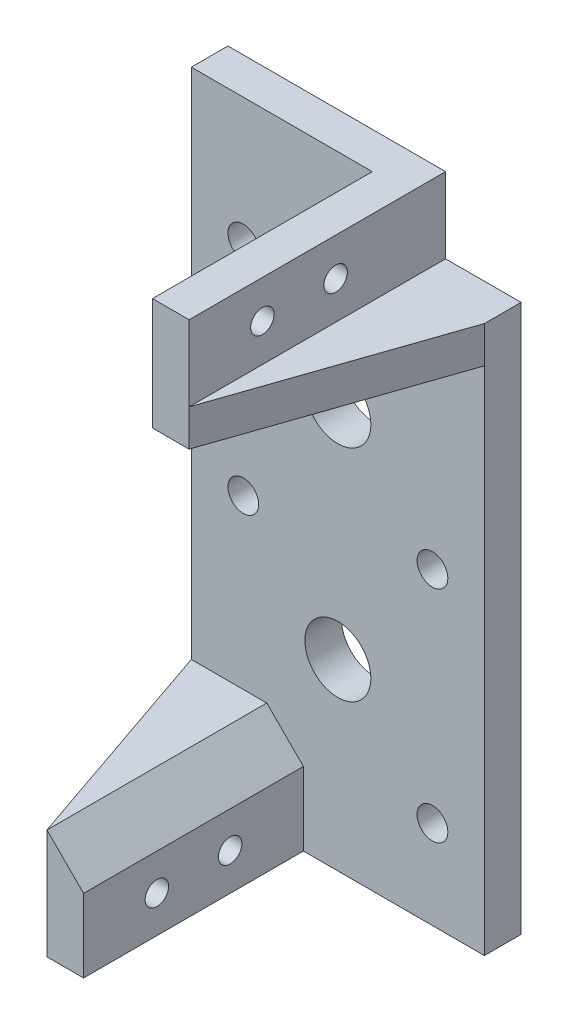
ISO-10303-21;
HEADER;
FILE_DESCRIPTION(('STEP AP214'),'2;1');
FILE_NAME('part.step','',(''),(''),'','','');
FILE_SCHEMA(('AUTOMOTIVE_DESIGN { 1 0 10303 214 1 1 1 1 }'));
ENDSEC;
DATA;
#1=APPLICATION_CONTEXT('core data for automotive mechanical design processes');
#2=APPLICATION_PROTOCOL_DEFINITION('international standard','automotive_design',2000,#1);
#3=PRODUCT_CONTEXT('',#1,'mechanical');
#4=PRODUCT('Part','Part','',(#3));
#5=PRODUCT_RELATED_PRODUCT_CATEGORY('part','',(#4));
#6=PRODUCT_DEFINITION_FORMATION('','',#4);
#7=PRODUCT_DEFINITION_CONTEXT('part definition',#1,'design');
#8=PRODUCT_DEFINITION('design','',#6,#7);
#9=PRODUCT_DEFINITION_SHAPE('','',#8);
#10=(LENGTH_UNIT() NAMED_UNIT(*) SI_UNIT(.MILLI.,.METRE.));
#11=(NAMED_UNIT(*) PLANE_ANGLE_UNIT() SI_UNIT($,.RADIAN.));
#12=(NAMED_UNIT(*) SI_UNIT($,.STERADIAN.) SOLID_ANGLE_UNIT());
#13=UNCERTAINTY_MEASURE_WITH_UNIT(LENGTH_MEASURE(1.E-05),#10,'distance_accuracy_value','');
#14=(GEOMETRIC_REPRESENTATION_CONTEXT(3) GLOBAL_UNCERTAINTY_ASSIGNED_CONTEXT((#13)) GLOBAL_UNIT_ASSIGNED_CONTEXT((#10,
#11,#12)) REPRESENTATION_CONTEXT('',''));
#15=CARTESIAN_POINT('',(0.,0.,0.));
#16=DIRECTION('',(0.,0.,1.));
#17=DIRECTION('',(1.,0.,0.));
#18=AXIS2_PLACEMENT_3D('',#15,#16,#17);
#19=CARTESIAN_POINT('',(0.,0.,0.));
#20=DIRECTION('',(0.,0.,-1.));
#21=DIRECTION('',(1.,0.,0.));
#22=AXIS2_PLACEMENT_3D('',#19,#20,#21);
#23=PLANE('',#22);
#24=CARTESIAN_POINT('',(32.9046987566547,-30.4046987566544,0.));
#25=DIRECTION('',(0.,0.,-1.));
#26=DIRECTION('',(-1.,0.,0.));
#27=AXIS2_PLACEMENT_3D('',#24,#25,#26);
#28=CIRCLE('',#27,2.1);
#29=CARTESIAN_POINT('',(30.8046987566547,-30.4046987566544,0.));
#30=VERTEX_POINT('',#29);
#31=EDGE_CURVE('E275',#30,#30,#28,.T.);
#32=ORIENTED_EDGE('',*,*,#31,.T.);
#33=EDGE_LOOP('',(#32));
#34=FACE_BOUND('',#33,.T.);
#35=CARTESIAN_POINT('',(7.09530124334588,25.4046987566544,0.));
#36=DIRECTION('',(0.,0.,-1.));
#37=DIRECTION('',(-1.,0.,0.));
#38=AXIS2_PLACEMENT_3D('',#35,#36,#37);
#39=CIRCLE('',#38,2.1);
#40=CARTESIAN_POINT('',(4.99530124334588,25.4046987566544,0.));
#41=VERTEX_POINT('',#40);
#42=EDGE_CURVE('E276',#41,#41,#39,.T.);
#43=ORIENTED_EDGE('',*,*,#42,.T.);
#44=EDGE_LOOP('',(#43));
#45=FACE_BOUND('',#44,.T.);
#46=CARTESIAN_POINT('',(32.904698756655,-0.404698756654425,0.));
#47=DIRECTION('',(0.,0.,-1.));
#48=DIRECTION('',(-1.,0.,0.));
#49=AXIS2_PLACEMENT_3D('',#46,#47,#48);
#50=CIRCLE('',#49,2.1);
#51=CARTESIAN_POINT('',(30.804698756655,-0.404698756654425,0.));
#52=VERTEX_POINT('',#51);
#53=EDGE_CURVE('E283',#52,#52,#50,.T.);
#54=ORIENTED_EDGE('',*,*,#53,.T.);
#55=EDGE_LOOP('',(#54));
#56=FACE_BOUND('',#55,.T.);
#57=CARTESIAN_POINT('',(20.0000000000001,-17.5,0.));
#58=DIRECTION('',(0.,0.,-1.));
#59=DIRECTION('',(-1.,0.,0.));
#60=AXIS2_PLACEMENT_3D('',#57,#58,#59);
#61=CIRCLE('',#60,4.5);
#62=CARTESIAN_POINT('',(15.5000000000001,-17.5,0.));
#63=VERTEX_POINT('',#62);
#64=EDGE_CURVE('E262',#63,#63,#61,.T.);
#65=ORIENTED_EDGE('',*,*,#64,.T.);
#66=EDGE_LOOP('',(#65));
#67=FACE_BOUND('',#66,.T.);
#68=CARTESIAN_POINT('',(7.09530124334557,-4.59530124334556,0.));
#69=DIRECTION('',(0.,0.,-1.));
#70=DIRECTION('',(-1.,0.,0.));
#71=AXIS2_PLACEMENT_3D('',#68,#69,#70);
#72=CIRCLE('',#71,2.1);
#73=CARTESIAN_POINT('',(4.99530124334556,-4.59530124334556,0.));
#74=VERTEX_POINT('',#73);
#75=EDGE_CURVE('E269',#74,#74,#72,.T.);
#76=ORIENTED_EDGE('',*,*,#75,.T.);
#77=EDGE_LOOP('',(#76));
#78=FACE_BOUND('',#77,.T.);
#79=CARTESIAN_POINT('',(20.0000000000004,12.5,0.));
#80=DIRECTION('',(0.,0.,-1.));
#81=DIRECTION('',(-1.,0.,0.));
#82=AXIS2_PLACEMENT_3D('',#79,#80,#81);
#83=CIRCLE('',#82,4.5);
#84=CARTESIAN_POINT('',(15.5000000000004,12.5,0.));
#85=VERTEX_POINT('',#84);
#86=EDGE_CURVE('E292',#85,#85,#83,.T.);
#87=ORIENTED_EDGE('',*,*,#86,.T.);
#88=EDGE_LOOP('',(#87));
#89=FACE_BOUND('',#88,.T.);
#90=DIRECTION('',(1.,0.,0.));
#91=VECTOR('',#90,1.);
#92=CARTESIAN_POINT('',(10.3,-27.5,0.));
#93=LINE('',#92,#91);
#94=CARTESIAN_POINT('',(0.,-27.5,0.));
#95=VERTEX_POINT('',#94);
#96=CARTESIAN_POINT('',(10.3,-27.5,0.));
#97=VERTEX_POINT('',#96);
#98=EDGE_CURVE('E185',#95,#97,#93,.T.);
#99=ORIENTED_EDGE('',*,*,#98,.T.);
#100=DIRECTION('',(0.707106781186547,-0.707106781186548,0.));
#101=VECTOR('',#100,1.);
#102=CARTESIAN_POINT('',(-8.59999999999998,-8.59999999999998,0.));
#103=LINE('',#102,#101);
#104=CARTESIAN_POINT('',(15.3,-32.5,0.));
#105=VERTEX_POINT('',#104);
#106=EDGE_CURVE('E11',#105,#97,#103,.F.);
#107=ORIENTED_EDGE('',*,*,#106,.F.);
#108=DIRECTION('',(0.,-1.,0.));
#109=VECTOR('',#108,1.);
#110=CARTESIAN_POINT('',(15.3,-42.5,0.));
#111=LINE('',#110,#109);
#112=CARTESIAN_POINT('',(15.3,-42.5,0.));
#113=VERTEX_POINT('',#112);
#114=EDGE_CURVE('E180',#105,#113,#111,.T.);
#115=ORIENTED_EDGE('',*,*,#114,.T.);
#116=DIRECTION('',(1.,0.,0.));
#117=VECTOR('',#116,1.);
#118=CARTESIAN_POINT('',(-40.,-42.5,0.));
#119=LINE('',#118,#117);
#120=CARTESIAN_POINT('',(40.,-42.5,0.));
#121=VERTEX_POINT('',#120);
#122=EDGE_CURVE('E302',#113,#121,#119,.T.);
#123=ORIENTED_EDGE('',*,*,#122,.T.);
#124=DIRECTION('',(0.,1.,0.));
#125=VECTOR('',#124,1.);
#126=CARTESIAN_POINT('',(40.,42.5,0.));
#127=LINE('',#126,#125);
#128=CARTESIAN_POINT('',(40.,27.2,0.));
#129=VERTEX_POINT('',#128);
#130=EDGE_CURVE('E295',#121,#129,#127,.T.);
#131=ORIENTED_EDGE('',*,*,#130,.T.);
#132=DIRECTION('',(-1.,0.,0.));
#133=VECTOR('',#132,1.);
#134=CARTESIAN_POINT('',(0.,27.2,0.));
#135=LINE('',#134,#133);
#136=CARTESIAN_POINT('',(24.7,27.2,0.));
#137=VERTEX_POINT('',#136);
#138=EDGE_CURVE('E224',#129,#137,#135,.T.);
#139=ORIENTED_EDGE('',*,*,#138,.T.);
#140=DIRECTION('',(0.,1.,0.));
#141=VECTOR('',#140,1.);
#142=CARTESIAN_POINT('',(24.7,42.5,0.));
#143=LINE('',#142,#141);
#144=CARTESIAN_POINT('',(24.7,42.5,0.));
#145=VERTEX_POINT('',#144);
#146=EDGE_CURVE('E227',#137,#145,#143,.T.);
#147=ORIENTED_EDGE('',*,*,#146,.T.);
#148=DIRECTION('',(-1.,0.,0.));
#149=VECTOR('',#148,1.);
#150=CARTESIAN_POINT('',(-40.,42.5,0.));
#151=LINE('',#150,#149);
#152=CARTESIAN_POINT('',(0.,42.5,0.));
#153=VERTEX_POINT('',#152);
#154=EDGE_CURVE('E310',#145,#153,#151,.T.);
#155=ORIENTED_EDGE('',*,*,#154,.T.);
#156=DIRECTION('',(0.,-1.,0.));
#157=VECTOR('',#156,1.);
#158=CARTESIAN_POINT('',(0.,-42.5,0.));
#159=LINE('',#158,#157);
#160=EDGE_CURVE('E240',#153,#95,#159,.T.);
#161=ORIENTED_EDGE('',*,*,#160,.T.);
#162=EDGE_LOOP('',(#99,#107,#115,#123,#131,#139,#147,#155,#161));
#163=FACE_BOUND('',#162,.T.);
#164=ADVANCED_FACE('F35',(#34,#45,#56,#67,#78,#89,#163),#23,.F.);
#165=CARTESIAN_POINT('',(40.,42.5,-5.));
#166=DIRECTION('',(-1.,0.,0.));
#167=DIRECTION('',(0.,-1.,0.));
#168=AXIS2_PLACEMENT_3D('',#165,#166,#167);
#169=PLANE('',#168);
#170=DIRECTION('',(0.,0.,1.));
#171=VECTOR('',#170,1.);
#172=CARTESIAN_POINT('',(40.,32.2,-5.001));
#173=LINE('',#172,#171);
#174=CARTESIAN_POINT('',(40.,32.2,-5.));
#175=VERTEX_POINT('',#174);
#176=CARTESIAN_POINT('',(40.,32.2,0.));
#177=VERTEX_POINT('',#176);
#178=EDGE_CURVE('E249',#175,#177,#173,.T.);
#179=ORIENTED_EDGE('',*,*,#178,.T.);
#180=DIRECTION('',(0.,1.,0.));
#181=VECTOR('',#180,1.);
#182=CARTESIAN_POINT('',(40.,27.2,0.));
#183=LINE('',#182,#181);
#184=EDGE_CURVE('E218',#129,#177,#183,.T.);
#185=ORIENTED_EDGE('',*,*,#184,.F.);
#186=ORIENTED_EDGE('',*,*,#130,.F.);
#187=DIRECTION('',(0.,0.,1.));
#188=VECTOR('',#187,1.);
#189=CARTESIAN_POINT('',(40.,-42.5,-5.));
#190=LINE('',#189,#188);
#191=CARTESIAN_POINT('',(40.,-42.5,-5.));
#192=VERTEX_POINT('',#191);
#193=EDGE_CURVE('E307',#192,#121,#190,.T.);
#194=ORIENTED_EDGE('',*,*,#193,.F.);
#195=DIRECTION('',(0.,1.,0.));
#196=VECTOR('',#195,1.);
#197=CARTESIAN_POINT('',(40.,42.5,-5.));
#198=LINE('',#197,#196);
#199=EDGE_CURVE('E298',#192,#175,#198,.T.);
#200=ORIENTED_EDGE('',*,*,#199,.T.);
#201=EDGE_LOOP('',(#179,#185,#186,#194,#200));
#202=FACE_BOUND('',#201,.T.);
#203=ADVANCED_FACE('F361',(#202),#169,.F.);
#204=CARTESIAN_POINT('',(-40.,42.5,-5.));
#205=DIRECTION('',(0.,-1.,0.));
#206=DIRECTION('',(0.,0.,1.));
#207=AXIS2_PLACEMENT_3D('',#204,#205,#206);
#208=PLANE('',#207);
#209=DIRECTION('',(0.,0.,1.));
#210=VECTOR('',#209,1.);
#211=CARTESIAN_POINT('',(29.7,42.5,-5.001));
#212=LINE('',#211,#210);
#213=CARTESIAN_POINT('',(29.7,42.5,-5.));
#214=VERTEX_POINT('',#213);
#215=CARTESIAN_POINT('',(29.7,42.5,30.));
#216=VERTEX_POINT('',#215);
#217=EDGE_CURVE('E250',#214,#216,#212,.T.);
#218=ORIENTED_EDGE('',*,*,#217,.F.);
#219=DIRECTION('',(-1.,0.,0.));
#220=VECTOR('',#219,1.);
#221=CARTESIAN_POINT('',(-40.,42.5,-5.));
#222=LINE('',#221,#220);
#223=CARTESIAN_POINT('',(0.,42.5,-5.));
#224=VERTEX_POINT('',#223);
#225=EDGE_CURVE('E301',#214,#224,#222,.T.);
#226=ORIENTED_EDGE('',*,*,#225,.T.);
#227=DIRECTION('',(0.,0.,1.));
#228=VECTOR('',#227,1.);
#229=CARTESIAN_POINT('',(0.,42.5,-10.));
#230=LINE('',#229,#228);
#231=EDGE_CURVE('E243',#224,#153,#230,.T.);
#232=ORIENTED_EDGE('',*,*,#231,.T.);
#233=ORIENTED_EDGE('',*,*,#154,.F.);
#234=DIRECTION('',(0.,0.,-1.));
#235=VECTOR('',#234,1.);
#236=CARTESIAN_POINT('',(24.7,42.5,30.));
#237=LINE('',#236,#235);
#238=CARTESIAN_POINT('',(24.7,42.5,30.));
#239=VERTEX_POINT('',#238);
#240=EDGE_CURVE('E236',#239,#145,#237,.T.);
#241=ORIENTED_EDGE('',*,*,#240,.F.);
#242=DIRECTION('',(1.,0.,0.));
#243=VECTOR('',#242,1.);
#244=CARTESIAN_POINT('',(29.7,42.5,30.));
#245=LINE('',#244,#243);
#246=EDGE_CURVE('E233',#239,#216,#245,.T.);
#247=ORIENTED_EDGE('',*,*,#246,.T.);
#248=EDGE_LOOP('',(#218,#226,#232,#233,#241,#247));
#249=FACE_BOUND('',#248,.T.);
#250=ADVANCED_FACE('F341',(#249),#208,.F.);
#251=CARTESIAN_POINT('',(-40.,-42.5,-5.));
#252=DIRECTION('',(0.,1.,0.));
#253=DIRECTION('',(0.,0.,-1.));
#254=AXIS2_PLACEMENT_3D('',#251,#252,#253);
#255=PLANE('',#254);
#256=DIRECTION('',(1.,0.,0.));
#257=VECTOR('',#256,1.);
#258=CARTESIAN_POINT('',(-40.,-42.5,-5.));
#259=LINE('',#258,#257);
#260=CARTESIAN_POINT('',(10.3,-42.5,-5.));
#261=VERTEX_POINT('',#260);
#262=EDGE_CURVE('E305',#261,#192,#259,.T.);
#263=ORIENTED_EDGE('',*,*,#262,.T.);
#264=ORIENTED_EDGE('',*,*,#193,.T.);
#265=ORIENTED_EDGE('',*,*,#122,.F.);
#266=DIRECTION('',(0.,0.,-1.));
#267=VECTOR('',#266,1.);
#268=CARTESIAN_POINT('',(15.3,-42.5,30.));
#269=LINE('',#268,#267);
#270=CARTESIAN_POINT('',(15.3,-42.5,30.));
#271=VERTEX_POINT('',#270);
#272=EDGE_CURVE('E190',#271,#113,#269,.T.);
#273=ORIENTED_EDGE('',*,*,#272,.F.);
#274=DIRECTION('',(-1.,0.,0.));
#275=VECTOR('',#274,1.);
#276=CARTESIAN_POINT('',(10.3,-42.5,30.));
#277=LINE('',#276,#275);
#278=CARTESIAN_POINT('',(10.3,-42.5,30.));
#279=VERTEX_POINT('',#278);
#280=EDGE_CURVE('E182',#271,#279,#277,.T.);
#281=ORIENTED_EDGE('',*,*,#280,.T.);
#282=DIRECTION('',(0.,0.,1.));
#283=VECTOR('',#282,1.);
#284=CARTESIAN_POINT('',(10.3,-42.5,-5.001));
#285=LINE('',#284,#283);
#286=EDGE_CURVE('E177',#261,#279,#285,.T.);
#287=ORIENTED_EDGE('',*,*,#286,.F.);
#288=EDGE_LOOP('',(#263,#264,#265,#273,#281,#287));
#289=FACE_BOUND('',#288,.T.);
#290=ADVANCED_FACE('F353',(#289),#255,.F.);
#291=CARTESIAN_POINT('',(0.,0.,-5.));
#292=DIRECTION('',(0.,0.,-1.));
#293=DIRECTION('',(1.,0.,0.));
#294=AXIS2_PLACEMENT_3D('',#291,#292,#293);
#295=PLANE('',#294);
#296=DIRECTION('',(0.,-1.,0.));
#297=VECTOR('',#296,1.);
#298=CARTESIAN_POINT('',(10.3,-42.5,-5.));
#299=LINE('',#298,#297);
#300=CARTESIAN_POINT('',(10.3,-32.2,-5.));
#301=VERTEX_POINT('',#300);
#302=EDGE_CURVE('E195',#301,#261,#299,.T.);
#303=ORIENTED_EDGE('',*,*,#302,.F.);
#304=DIRECTION('',(1.,0.,0.));
#305=VECTOR('',#304,1.);
#306=CARTESIAN_POINT('',(0.,-32.2,-5.));
#307=LINE('',#306,#305);
#308=CARTESIAN_POINT('',(0.,-32.2,-5.));
#309=VERTEX_POINT('',#308);
#310=EDGE_CURVE('E201',#309,#301,#307,.T.);
#311=ORIENTED_EDGE('',*,*,#310,.F.);
#312=DIRECTION('',(0.,1.,0.));
#313=VECTOR('',#312,1.);
#314=CARTESIAN_POINT('',(0.,0.,-5.));
#315=LINE('',#314,#313);
#316=EDGE_CURVE('E245',#309,#224,#315,.T.);
#317=ORIENTED_EDGE('',*,*,#316,.T.);
#318=ORIENTED_EDGE('',*,*,#225,.F.);
#319=DIRECTION('',(0.,1.,0.));
#320=VECTOR('',#319,1.);
#321=CARTESIAN_POINT('',(29.7,42.5,-5.));
#322=LINE('',#321,#320);
#323=CARTESIAN_POINT('',(29.7,32.2,-5.));
#324=VERTEX_POINT('',#323);
#325=EDGE_CURVE('E247',#324,#214,#322,.T.);
#326=ORIENTED_EDGE('',*,*,#325,.F.);
#327=DIRECTION('',(-1.,0.,0.));
#328=VECTOR('',#327,1.);
#329=CARTESIAN_POINT('',(40.,32.2,-5.));
#330=LINE('',#329,#328);
#331=EDGE_CURVE('E253',#175,#324,#330,.T.);
#332=ORIENTED_EDGE('',*,*,#331,.F.);
#333=ORIENTED_EDGE('',*,*,#199,.F.);
#334=ORIENTED_EDGE('',*,*,#262,.F.);
#335=EDGE_LOOP('',(#303,#311,#317,#318,#326,#332,#333,#334));
#336=FACE_BOUND('',#335,.T.);
#337=CARTESIAN_POINT('',(32.9046987566547,-30.4046987566544,-5.));
#338=DIRECTION('',(0.,0.,1.));
#339=DIRECTION('',(1.,0.,0.));
#340=AXIS2_PLACEMENT_3D('',#337,#338,#339);
#341=CIRCLE('',#340,2.1);
#342=CARTESIAN_POINT('',(35.0046987566547,-30.4046987566544,-5.));
#343=VERTEX_POINT('',#342);
#344=EDGE_CURVE('E261',#343,#343,#341,.F.);
#345=ORIENTED_EDGE('',*,*,#344,.F.);
#346=EDGE_LOOP('',(#345));
#347=FACE_BOUND('',#346,.T.);
#348=CARTESIAN_POINT('',(7.09530124334588,25.4046987566544,-5.));
#349=DIRECTION('',(0.,0.,1.));
#350=DIRECTION('',(1.,0.,0.));
#351=AXIS2_PLACEMENT_3D('',#348,#349,#350);
#352=CIRCLE('',#351,2.1);
#353=CARTESIAN_POINT('',(9.19530124334588,25.4046987566544,-5.));
#354=VERTEX_POINT('',#353);
#355=EDGE_CURVE('E280',#354,#354,#352,.F.);
#356=ORIENTED_EDGE('',*,*,#355,.F.);
#357=EDGE_LOOP('',(#356));
#358=FACE_BOUND('',#357,.T.);
#359=CARTESIAN_POINT('',(32.904698756655,-0.404698756654425,-5.));
#360=DIRECTION('',(0.,0.,1.));
#361=DIRECTION('',(1.,0.,0.));
#362=AXIS2_PLACEMENT_3D('',#359,#360,#361);
#363=CIRCLE('',#362,2.1);
#364=CARTESIAN_POINT('',(35.004698756655,-0.404698756654425,-5.));
#365=VERTEX_POINT('',#364);
#366=EDGE_CURVE('E265',#365,#365,#363,.F.);
#367=ORIENTED_EDGE('',*,*,#366,.F.);
#368=EDGE_LOOP('',(#367));
#369=FACE_BOUND('',#368,.T.);
#370=CARTESIAN_POINT('',(20.0000000000001,-17.5,-5.));
#371=DIRECTION('',(0.,0.,1.));
#372=DIRECTION('',(1.,0.,0.));
#373=AXIS2_PLACEMENT_3D('',#370,#371,#372);
#374=CIRCLE('',#373,4.5);
#375=CARTESIAN_POINT('',(24.5000000000001,-17.5,-5.));
#376=VERTEX_POINT('',#375);
#377=EDGE_CURVE('E266',#376,#376,#374,.F.);
#378=ORIENTED_EDGE('',*,*,#377,.F.);
#379=EDGE_LOOP('',(#378));
#380=FACE_BOUND('',#379,.T.);
#381=CARTESIAN_POINT('',(7.09530124334557,-4.59530124334556,-5.));
#382=DIRECTION('',(0.,0.,1.));
#383=DIRECTION('',(1.,0.,0.));
#384=AXIS2_PLACEMENT_3D('',#381,#382,#383);
#385=CIRCLE('',#384,2.1);
#386=CARTESIAN_POINT('',(9.19530124334557,-4.59530124334556,-5.));
#387=VERTEX_POINT('',#386);
#388=EDGE_CURVE('E272',#387,#387,#385,.F.);
#389=ORIENTED_EDGE('',*,*,#388,.F.);
#390=EDGE_LOOP('',(#389));
#391=FACE_BOUND('',#390,.T.);
#392=CARTESIAN_POINT('',(20.0000000000004,12.5,-5.));
#393=DIRECTION('',(0.,0.,1.));
#394=DIRECTION('',(1.,0.,0.));
#395=AXIS2_PLACEMENT_3D('',#392,#393,#394);
#396=CIRCLE('',#395,4.5);
#397=CARTESIAN_POINT('',(24.5000000000004,12.5,-5.));
#398=VERTEX_POINT('',#397);
#399=EDGE_CURVE('E279',#398,#398,#396,.F.);
#400=ORIENTED_EDGE('',*,*,#399,.F.);
#401=EDGE_LOOP('',(#400));
#402=FACE_BOUND('',#401,.T.);
#403=ADVANCED_FACE('F346',(#336,#347,#358,#369,#380,#391,#402),#295,.T.);
#404=CARTESIAN_POINT('',(20.0000000000004,12.5,-5.001));
#405=DIRECTION('',(0.,0.,1.));
#406=DIRECTION('',(-1.,0.,0.));
#407=AXIS2_PLACEMENT_3D('',#404,#405,#406);
#408=CYLINDRICAL_SURFACE('',#407,4.5);
#409=ORIENTED_EDGE('',*,*,#399,.T.);
#410=EDGE_LOOP('',(#409));
#411=FACE_BOUND('',#410,.T.);
#412=ORIENTED_EDGE('',*,*,#86,.F.);
#413=EDGE_LOOP('',(#412));
#414=FACE_BOUND('',#413,.T.);
#415=ADVANCED_FACE('F404',(#411,#414),#408,.F.);
#416=CARTESIAN_POINT('',(7.09530124334557,-4.59530124334556,-5.001));
#417=DIRECTION('',(0.,0.,1.));
#418=DIRECTION('',(-1.,0.,0.));
#419=AXIS2_PLACEMENT_3D('',#416,#417,#418);
#420=CYLINDRICAL_SURFACE('',#419,2.1);
#421=ORIENTED_EDGE('',*,*,#388,.T.);
#422=EDGE_LOOP('',(#421));
#423=FACE_BOUND('',#422,.T.);
#424=ORIENTED_EDGE('',*,*,#75,.F.);
#425=EDGE_LOOP('',(#424));
#426=FACE_BOUND('',#425,.T.);
#427=ADVANCED_FACE('F410',(#423,#426),#420,.F.);
#428=CARTESIAN_POINT('',(20.0000000000001,-17.5,-5.001));
#429=DIRECTION('',(0.,0.,1.));
#430=DIRECTION('',(-1.,0.,0.));
#431=AXIS2_PLACEMENT_3D('',#428,#429,#430);
#432=CYLINDRICAL_SURFACE('',#431,4.5);
#433=ORIENTED_EDGE('',*,*,#377,.T.);
#434=EDGE_LOOP('',(#433));
#435=FACE_BOUND('',#434,.T.);
#436=ORIENTED_EDGE('',*,*,#64,.F.);
#437=EDGE_LOOP('',(#436));
#438=FACE_BOUND('',#437,.T.);
#439=ADVANCED_FACE('F417',(#435,#438),#432,.F.);
#440=CARTESIAN_POINT('',(32.904698756655,-0.404698756654425,-5.001));
#441=DIRECTION('',(0.,0.,1.));
#442=DIRECTION('',(-1.,0.,0.));
#443=AXIS2_PLACEMENT_3D('',#440,#441,#442);
#444=CYLINDRICAL_SURFACE('',#443,2.1);
#445=ORIENTED_EDGE('',*,*,#366,.T.);
#446=EDGE_LOOP('',(#445));
#447=FACE_BOUND('',#446,.T.);
#448=ORIENTED_EDGE('',*,*,#53,.F.);
#449=EDGE_LOOP('',(#448));
#450=FACE_BOUND('',#449,.T.);
#451=ADVANCED_FACE('F425',(#447,#450),#444,.F.);
#452=CARTESIAN_POINT('',(7.09530124334588,25.4046987566544,-5.001));
#453=DIRECTION('',(0.,0.,1.));
#454=DIRECTION('',(-1.,0.,0.));
#455=AXIS2_PLACEMENT_3D('',#452,#453,#454);
#456=CYLINDRICAL_SURFACE('',#455,2.1);
#457=ORIENTED_EDGE('',*,*,#355,.T.);
#458=EDGE_LOOP('',(#457));
#459=FACE_BOUND('',#458,.T.);
#460=ORIENTED_EDGE('',*,*,#42,.F.);
#461=EDGE_LOOP('',(#460));
#462=FACE_BOUND('',#461,.T.);
#463=ADVANCED_FACE('F433',(#459,#462),#456,.F.);
#464=CARTESIAN_POINT('',(32.9046987566547,-30.4046987566544,-5.001));
#465=DIRECTION('',(0.,0.,1.));
#466=DIRECTION('',(-1.,0.,0.));
#467=AXIS2_PLACEMENT_3D('',#464,#465,#466);
#468=CYLINDRICAL_SURFACE('',#467,2.1);
#469=ORIENTED_EDGE('',*,*,#344,.T.);
#470=EDGE_LOOP('',(#469));
#471=FACE_BOUND('',#470,.T.);
#472=ORIENTED_EDGE('',*,*,#31,.F.);
#473=EDGE_LOOP('',(#472));
#474=FACE_BOUND('',#473,.T.);
#475=ADVANCED_FACE('F441',(#471,#474),#468,.F.);
#476=CARTESIAN_POINT('',(29.7,42.5,-5.001));
#477=DIRECTION('',(-1.,0.,0.));
#478=DIRECTION('',(0.,-1.,0.));
#479=AXIS2_PLACEMENT_3D('',#476,#477,#478);
#480=PLANE('',#479);
#481=CARTESIAN_POINT('',(29.7,37.35,20.));
#482=DIRECTION('',(-1.,0.,0.));
#483=DIRECTION('',(0.,1.,0.));
#484=AXIS2_PLACEMENT_3D('',#481,#482,#483);
#485=CIRCLE('',#484,1.6);
#486=CARTESIAN_POINT('',(29.7,38.95,20.));
#487=VERTEX_POINT('',#486);
#488=EDGE_CURVE('E610',#487,#487,#485,.T.);
#489=ORIENTED_EDGE('',*,*,#488,.T.);
#490=EDGE_LOOP('',(#489));
#491=FACE_BOUND('',#490,.T.);
#492=CARTESIAN_POINT('',(29.7,37.35,10.));
#493=DIRECTION('',(-1.,0.,0.));
#494=DIRECTION('',(0.,1.,0.));
#495=AXIS2_PLACEMENT_3D('',#492,#493,#494);
#496=CIRCLE('',#495,1.6);
#497=CARTESIAN_POINT('',(29.7,38.95,10.));
#498=VERTEX_POINT('',#497);
#499=EDGE_CURVE('E622',#498,#498,#496,.T.);
#500=ORIENTED_EDGE('',*,*,#499,.T.);
#501=EDGE_LOOP('',(#500));
#502=FACE_BOUND('',#501,.T.);
#503=DIRECTION('',(0.,0.,1.));
#504=VECTOR('',#503,1.);
#505=CARTESIAN_POINT('',(29.7,32.2,-5.001));
#506=LINE('',#505,#504);
#507=CARTESIAN_POINT('',(29.7,32.2,30.));
#508=VERTEX_POINT('',#507);
#509=EDGE_CURVE('E254',#324,#508,#506,.T.);
#510=ORIENTED_EDGE('',*,*,#509,.F.);
#511=ORIENTED_EDGE('',*,*,#325,.T.);
#512=ORIENTED_EDGE('',*,*,#217,.T.);
#513=DIRECTION('',(0.,-1.,0.));
#514=VECTOR('',#513,1.);
#515=CARTESIAN_POINT('',(29.7,42.5,30.));
#516=LINE('',#515,#514);
#517=EDGE_CURVE('E228',#216,#508,#516,.T.);
#518=ORIENTED_EDGE('',*,*,#517,.T.);
#519=EDGE_LOOP('',(#510,#511,#512,#518));
#520=FACE_BOUND('',#519,.T.);
#521=ADVANCED_FACE('F449',(#491,#502,#520),#480,.F.);
#522=CARTESIAN_POINT('',(40.,32.2,-5.001));
#523=DIRECTION('',(0.,-1.,0.));
#524=DIRECTION('',(0.,0.,1.));
#525=AXIS2_PLACEMENT_3D('',#522,#523,#524);
#526=PLANE('',#525);
#527=ORIENTED_EDGE('',*,*,#178,.F.);
#528=ORIENTED_EDGE('',*,*,#331,.T.);
#529=ORIENTED_EDGE('',*,*,#509,.T.);
#530=DIRECTION('',(0.324727305226086,0.,-0.945807685124521));
#531=VECTOR('',#530,1.);
#532=CARTESIAN_POINT('',(40.,32.2,0.));
#533=LINE('',#532,#531);
#534=EDGE_CURVE('E209',#508,#177,#533,.T.);
#535=ORIENTED_EDGE('',*,*,#534,.T.);
#536=EDGE_LOOP('',(#527,#528,#529,#535));
#537=FACE_BOUND('',#536,.T.);
#538=ADVANCED_FACE('F457',(#537),#526,.F.);
#539=CARTESIAN_POINT('',(0.,-42.5,-10.));
#540=DIRECTION('',(1.,0.,0.));
#541=DIRECTION('',(0.,0.,1.));
#542=AXIS2_PLACEMENT_3D('',#539,#540,#541);
#543=PLANE('',#542);
#544=ORIENTED_EDGE('',*,*,#160,.F.);
#545=ORIENTED_EDGE('',*,*,#231,.F.);
#546=ORIENTED_EDGE('',*,*,#316,.F.);
#547=DIRECTION('',(0.,0.,1.));
#548=VECTOR('',#547,1.);
#549=CARTESIAN_POINT('',(0.,-32.2,-5.001));
#550=LINE('',#549,#548);
#551=CARTESIAN_POINT('',(0.,-32.2,0.));
#552=VERTEX_POINT('',#551);
#553=EDGE_CURVE('E199',#309,#552,#550,.T.);
#554=ORIENTED_EDGE('',*,*,#553,.T.);
#555=DIRECTION('',(0.,1.,0.));
#556=VECTOR('',#555,1.);
#557=CARTESIAN_POINT('',(0.,-32.5,0.));
#558=LINE('',#557,#556);
#559=EDGE_CURVE('E166',#552,#95,#558,.T.);
#560=ORIENTED_EDGE('',*,*,#559,.T.);
#561=EDGE_LOOP('',(#544,#545,#546,#554,#560));
#562=FACE_BOUND('',#561,.T.);
#563=ADVANCED_FACE('F332',(#562),#543,.F.);
#564=CARTESIAN_POINT('',(24.7,42.5,30.));
#565=DIRECTION('',(1.,0.,0.));
#566=DIRECTION('',(0.,0.,1.));
#567=AXIS2_PLACEMENT_3D('',#564,#565,#566);
#568=PLANE('',#567);
#569=CARTESIAN_POINT('',(24.7,37.35,20.));
#570=DIRECTION('',(-1.,0.,0.));
#571=DIRECTION('',(0.,0.,1.));
#572=AXIS2_PLACEMENT_3D('',#569,#570,#571);
#573=CIRCLE('',#572,1.6);
#574=CARTESIAN_POINT('',(24.7,37.35,21.6));
#575=VERTEX_POINT('',#574);
#576=EDGE_CURVE('E613',#575,#575,#573,.F.);
#577=ORIENTED_EDGE('',*,*,#576,.T.);
#578=EDGE_LOOP('',(#577));
#579=FACE_BOUND('',#578,.T.);
#580=CARTESIAN_POINT('',(24.7,37.35,10.));
#581=DIRECTION('',(-1.,0.,0.));
#582=DIRECTION('',(0.,0.,1.));
#583=AXIS2_PLACEMENT_3D('',#580,#581,#582);
#584=CIRCLE('',#583,1.6);
#585=CARTESIAN_POINT('',(24.7,37.35,11.6));
#586=VERTEX_POINT('',#585);
#587=EDGE_CURVE('E619',#586,#586,#584,.F.);
#588=ORIENTED_EDGE('',*,*,#587,.T.);
#589=EDGE_LOOP('',(#588));
#590=FACE_BOUND('',#589,.T.);
#591=ORIENTED_EDGE('',*,*,#146,.F.);
#592=DIRECTION('',(0.,0.,1.));
#593=VECTOR('',#592,1.);
#594=CARTESIAN_POINT('',(24.7,27.2,30.));
#595=LINE('',#594,#593);
#596=CARTESIAN_POINT('',(24.7,27.2,30.));
#597=VERTEX_POINT('',#596);
#598=EDGE_CURVE('E210',#137,#597,#595,.T.);
#599=ORIENTED_EDGE('',*,*,#598,.T.);
#600=DIRECTION('',(0.,1.,0.));
#601=VECTOR('',#600,1.);
#602=CARTESIAN_POINT('',(24.7,42.5,30.));
#603=LINE('',#602,#601);
#604=EDGE_CURVE('E231',#597,#239,#603,.T.);
#605=ORIENTED_EDGE('',*,*,#604,.T.);
#606=ORIENTED_EDGE('',*,*,#240,.T.);
#607=EDGE_LOOP('',(#591,#599,#605,#606));
#608=FACE_BOUND('',#607,.T.);
#609=ADVANCED_FACE('F472',(#579,#590,#608),#568,.F.);
#610=CARTESIAN_POINT('',(0.,0.,30.));
#611=DIRECTION('',(0.,0.,1.));
#612=DIRECTION('',(-1.,0.,0.));
#613=AXIS2_PLACEMENT_3D('',#610,#611,#612);
#614=PLANE('',#613);
#615=ORIENTED_EDGE('',*,*,#517,.F.);
#616=ORIENTED_EDGE('',*,*,#246,.F.);
#617=ORIENTED_EDGE('',*,*,#604,.F.);
#618=DIRECTION('',(1.,0.,0.));
#619=VECTOR('',#618,1.);
#620=CARTESIAN_POINT('',(29.7,27.2,30.));
#621=LINE('',#620,#619);
#622=CARTESIAN_POINT('',(29.7,27.2,30.));
#623=VERTEX_POINT('',#622);
#624=EDGE_CURVE('E213',#597,#623,#621,.T.);
#625=ORIENTED_EDGE('',*,*,#624,.T.);
#626=DIRECTION('',(0.,1.,0.));
#627=VECTOR('',#626,1.);
#628=CARTESIAN_POINT('',(29.7,27.2,30.));
#629=LINE('',#628,#627);
#630=EDGE_CURVE('E222',#623,#508,#629,.T.);
#631=ORIENTED_EDGE('',*,*,#630,.T.);
#632=EDGE_LOOP('',(#615,#616,#617,#625,#631));
#633=FACE_BOUND('',#632,.T.);
#634=ADVANCED_FACE('F479',(#633),#614,.T.);
#635=CARTESIAN_POINT('',(0.,27.2,0.));
#636=DIRECTION('',(0.,1.,0.));
#637=DIRECTION('',(0.,0.,-1.));
#638=AXIS2_PLACEMENT_3D('',#635,#636,#637);
#639=PLANE('',#638);
#640=DIRECTION('',(0.324727305226086,0.,-0.945807685124521));
#641=VECTOR('',#640,1.);
#642=CARTESIAN_POINT('',(40.,27.2,0.));
#643=LINE('',#642,#641);
#644=EDGE_CURVE('E216',#623,#129,#643,.T.);
#645=ORIENTED_EDGE('',*,*,#644,.F.);
#646=ORIENTED_EDGE('',*,*,#624,.F.);
#647=ORIENTED_EDGE('',*,*,#598,.F.);
#648=ORIENTED_EDGE('',*,*,#138,.F.);
#649=EDGE_LOOP('',(#645,#646,#647,#648));
#650=FACE_BOUND('',#649,.T.);
#651=ADVANCED_FACE('F487',(#650),#639,.F.);
#652=CARTESIAN_POINT('',(40.,27.2,0.));
#653=DIRECTION('',(-0.945807685124521,0.,-0.324727305226086));
#654=DIRECTION('',(0.324727305226086,0.,-0.945807685124521));
#655=AXIS2_PLACEMENT_3D('',#652,#653,#654);
#656=PLANE('',#655);
#657=ORIENTED_EDGE('',*,*,#534,.F.);
#658=ORIENTED_EDGE('',*,*,#630,.F.);
#659=ORIENTED_EDGE('',*,*,#644,.T.);
#660=ORIENTED_EDGE('',*,*,#184,.T.);
#661=EDGE_LOOP('',(#657,#658,#659,#660));
#662=FACE_BOUND('',#661,.T.);
#663=ADVANCED_FACE('F495',(#662),#656,.F.);
#664=CARTESIAN_POINT('',(10.3,-42.5,-5.001));
#665=DIRECTION('',(1.,0.,0.));
#666=DIRECTION('',(0.,0.,1.));
#667=AXIS2_PLACEMENT_3D('',#664,#665,#666);
#668=PLANE('',#667);
#669=CARTESIAN_POINT('',(10.3,-37.4571428571428,20.));
#670=DIRECTION('',(1.,0.,0.));
#671=DIRECTION('',(0.,0.,-1.));
#672=AXIS2_PLACEMENT_3D('',#669,#670,#671);
#673=CIRCLE('',#672,1.6);
#674=CARTESIAN_POINT('',(10.3,-37.4571428571428,18.4));
#675=VERTEX_POINT('',#674);
#676=EDGE_CURVE('E324',#675,#675,#673,.T.);
#677=ORIENTED_EDGE('',*,*,#676,.T.);
#678=EDGE_LOOP('',(#677));
#679=FACE_BOUND('',#678,.T.);
#680=CARTESIAN_POINT('',(10.3,-37.4142857142857,10.));
#681=DIRECTION('',(1.,0.,0.));
#682=DIRECTION('',(0.,0.,-1.));
#683=AXIS2_PLACEMENT_3D('',#680,#681,#682);
#684=CIRCLE('',#683,1.6);
#685=CARTESIAN_POINT('',(10.3,-37.4142857142857,8.4));
#686=VERTEX_POINT('',#685);
#687=EDGE_CURVE('E614',#686,#686,#684,.T.);
#688=ORIENTED_EDGE('',*,*,#687,.T.);
#689=EDGE_LOOP('',(#688));
#690=FACE_BOUND('',#689,.T.);
#691=DIRECTION('',(0.,0.,1.));
#692=VECTOR('',#691,1.);
#693=CARTESIAN_POINT('',(10.3,-32.2,-5.001));
#694=LINE('',#693,#692);
#695=CARTESIAN_POINT('',(10.3,-32.2,0.));
#696=VERTEX_POINT('',#695);
#697=EDGE_CURVE('E202',#301,#696,#694,.T.);
#698=ORIENTED_EDGE('',*,*,#697,.F.);
#699=ORIENTED_EDGE('',*,*,#302,.T.);
#700=ORIENTED_EDGE('',*,*,#286,.T.);
#701=DIRECTION('',(0.,1.,0.));
#702=VECTOR('',#701,1.);
#703=CARTESIAN_POINT('',(10.3,-42.5,30.));
#704=LINE('',#703,#702);
#705=CARTESIAN_POINT('',(10.3,-32.5,30.));
#706=VERTEX_POINT('',#705);
#707=EDGE_CURVE('E163',#279,#706,#704,.T.);
#708=ORIENTED_EDGE('',*,*,#707,.T.);
#709=DIRECTION('',(0.,0.,1.));
#710=VECTOR('',#709,1.);
#711=CARTESIAN_POINT('',(10.3,-32.5,0.));
#712=LINE('',#711,#710);
#713=CARTESIAN_POINT('',(10.3,-32.5,0.));
#714=VERTEX_POINT('',#713);
#715=EDGE_CURVE('E157',#714,#706,#712,.T.);
#716=ORIENTED_EDGE('',*,*,#715,.F.);
#717=DIRECTION('',(0.,1.,0.));
#718=VECTOR('',#717,1.);
#719=CARTESIAN_POINT('',(10.3,-32.5,0.));
#720=LINE('',#719,#718);
#721=EDGE_CURVE('E192',#714,#696,#720,.T.);
#722=ORIENTED_EDGE('',*,*,#721,.T.);
#723=EDGE_LOOP('',(#698,#699,#700,#708,#716,#722));
#724=FACE_BOUND('',#723,.T.);
#725=ADVANCED_FACE('F175',(#679,#690,#724),#668,.F.);
#726=CARTESIAN_POINT('',(0.,-32.2,-5.001));
#727=DIRECTION('',(0.,1.,0.));
#728=DIRECTION('',(0.,0.,-1.));
#729=AXIS2_PLACEMENT_3D('',#726,#727,#728);
#730=PLANE('',#729);
#731=ORIENTED_EDGE('',*,*,#553,.F.);
#732=ORIENTED_EDGE('',*,*,#310,.T.);
#733=ORIENTED_EDGE('',*,*,#697,.T.);
#734=DIRECTION('',(1.,0.,0.));
#735=VECTOR('',#734,1.);
#736=CARTESIAN_POINT('',(0.,-32.2,0.));
#737=LINE('',#736,#735);
#738=EDGE_CURVE('E197',#552,#696,#737,.T.);
#739=ORIENTED_EDGE('',*,*,#738,.F.);
#740=EDGE_LOOP('',(#731,#732,#733,#739));
#741=FACE_BOUND('',#740,.T.);
#742=ADVANCED_FACE('F350',(#741),#730,.F.);
#743=CARTESIAN_POINT('',(10.3,-27.5,30.));
#744=DIRECTION('',(0.,-1.,0.));
#745=DIRECTION('',(0.,0.,1.));
#746=AXIS2_PLACEMENT_3D('',#743,#744,#745);
#747=PLANE('',#746);
#748=ORIENTED_EDGE('',*,*,#98,.F.);
#749=DIRECTION('',(-0.324727305226086,0.,-0.945807685124521));
#750=VECTOR('',#749,1.);
#751=CARTESIAN_POINT('',(10.3,-27.5,30.));
#752=LINE('',#751,#750);
#753=CARTESIAN_POINT('',(10.3,-27.5,30.));
#754=VERTEX_POINT('',#753);
#755=EDGE_CURVE('E173',#754,#95,#752,.T.);
#756=ORIENTED_EDGE('',*,*,#755,.F.);
#757=DIRECTION('',(0.,0.,1.));
#758=VECTOR('',#757,1.);
#759=CARTESIAN_POINT('',(10.3,-27.5,30.));
#760=LINE('',#759,#758);
#761=EDGE_CURVE('E50',#97,#754,#760,.T.);
#762=ORIENTED_EDGE('',*,*,#761,.F.);
#763=EDGE_LOOP('',(#748,#756,#762));
#764=FACE_BOUND('',#763,.T.);
#765=ADVANCED_FACE('F319',(#764),#747,.F.);
#766=CARTESIAN_POINT('',(15.3,-42.5,30.));
#767=DIRECTION('',(-1.,0.,0.));
#768=DIRECTION('',(0.,0.,-1.));
#769=AXIS2_PLACEMENT_3D('',#766,#767,#768);
#770=PLANE('',#769);
#771=CARTESIAN_POINT('',(15.3,-37.4571428571428,20.));
#772=DIRECTION('',(1.,0.,0.));
#773=DIRECTION('',(0.,0.,-1.));
#774=AXIS2_PLACEMENT_3D('',#771,#772,#773);
#775=CIRCLE('',#774,1.6);
#776=CARTESIAN_POINT('',(15.3,-37.4571428571428,18.4));
#777=VERTEX_POINT('',#776);
#778=EDGE_CURVE('E321',#777,#777,#775,.F.);
#779=ORIENTED_EDGE('',*,*,#778,.T.);
#780=EDGE_LOOP('',(#779));
#781=FACE_BOUND('',#780,.T.);
#782=CARTESIAN_POINT('',(15.3,-37.4142857142857,10.));
#783=DIRECTION('',(1.,0.,0.));
#784=DIRECTION('',(0.,0.,-1.));
#785=AXIS2_PLACEMENT_3D('',#782,#783,#784);
#786=CIRCLE('',#785,1.6);
#787=CARTESIAN_POINT('',(15.3,-37.4142857142857,8.4));
#788=VERTEX_POINT('',#787);
#789=EDGE_CURVE('E617',#788,#788,#786,.F.);
#790=ORIENTED_EDGE('',*,*,#789,.T.);
#791=EDGE_LOOP('',(#790));
#792=FACE_BOUND('',#791,.T.);
#793=DIRECTION('',(0.,-1.,0.));
#794=VECTOR('',#793,1.);
#795=CARTESIAN_POINT('',(15.3,-42.5,30.));
#796=LINE('',#795,#794);
#797=CARTESIAN_POINT('',(15.3,-32.5,30.));
#798=VERTEX_POINT('',#797);
#799=EDGE_CURVE('E179',#798,#271,#796,.T.);
#800=ORIENTED_EDGE('',*,*,#799,.T.);
#801=ORIENTED_EDGE('',*,*,#272,.T.);
#802=ORIENTED_EDGE('',*,*,#114,.F.);
#803=DIRECTION('',(0.,0.,-1.));
#804=VECTOR('',#803,1.);
#805=CARTESIAN_POINT('',(15.3,-32.5,30.));
#806=LINE('',#805,#804);
#807=EDGE_CURVE('E316',#798,#105,#806,.T.);
#808=ORIENTED_EDGE('',*,*,#807,.F.);
#809=EDGE_LOOP('',(#800,#801,#802,#808));
#810=FACE_BOUND('',#809,.T.);
#811=ADVANCED_FACE('F366',(#781,#792,#810),#770,.F.);
#812=CARTESIAN_POINT('',(0.,0.,30.));
#813=DIRECTION('',(0.,0.,1.));
#814=DIRECTION('',(-1.,0.,0.));
#815=AXIS2_PLACEMENT_3D('',#812,#813,#814);
#816=PLANE('',#815);
#817=DIRECTION('',(0.,1.,0.));
#818=VECTOR('',#817,1.);
#819=CARTESIAN_POINT('',(10.3,-32.5,30.));
#820=LINE('',#819,#818);
#821=EDGE_CURVE('E150',#706,#754,#820,.T.);
#822=ORIENTED_EDGE('',*,*,#821,.F.);
#823=ORIENTED_EDGE('',*,*,#707,.F.);
#824=ORIENTED_EDGE('',*,*,#280,.F.);
#825=ORIENTED_EDGE('',*,*,#799,.F.);
#826=DIRECTION('',(-0.707106781186547,0.707106781186548,0.));
#827=VECTOR('',#826,1.);
#828=CARTESIAN_POINT('',(-8.59999999999998,-8.59999999999998,30.));
#829=LINE('',#828,#827);
#830=EDGE_CURVE('E43',#754,#798,#829,.F.);
#831=ORIENTED_EDGE('',*,*,#830,.F.);
#832=EDGE_LOOP('',(#822,#823,#824,#825,#831));
#833=FACE_BOUND('',#832,.T.);
#834=ADVANCED_FACE('F160',(#833),#816,.T.);
#835=CARTESIAN_POINT('',(0.,-32.5,0.));
#836=DIRECTION('',(0.,0.,-1.));
#837=DIRECTION('',(1.,0.,0.));
#838=AXIS2_PLACEMENT_3D('',#835,#836,#837);
#839=PLANE('',#838);
#840=ORIENTED_EDGE('',*,*,#738,.T.);
#841=ORIENTED_EDGE('',*,*,#721,.F.);
#842=DIRECTION('',(1.,0.,0.));
#843=VECTOR('',#842,1.);
#844=CARTESIAN_POINT('',(0.,-32.5,0.));
#845=LINE('',#844,#843);
#846=CARTESIAN_POINT('',(0.,-32.5,0.));
#847=VERTEX_POINT('',#846);
#848=EDGE_CURVE('E156',#847,#714,#845,.T.);
#849=ORIENTED_EDGE('',*,*,#848,.F.);
#850=EDGE_CURVE('E152',#847,#552,#558,.T.);
#851=ORIENTED_EDGE('',*,*,#850,.T.);
#852=EDGE_LOOP('',(#840,#841,#849,#851));
#853=FACE_BOUND('',#852,.T.);
#854=ADVANCED_FACE('F351',(#853),#839,.T.);
#855=CARTESIAN_POINT('',(10.3,-32.5,30.));
#856=DIRECTION('',(-0.945807685124521,0.,0.324727305226086));
#857=DIRECTION('',(-0.324727305226086,0.,-0.945807685124521));
#858=AXIS2_PLACEMENT_3D('',#855,#856,#857);
#859=PLANE('',#858);
#860=ORIENTED_EDGE('',*,*,#755,.T.);
#861=ORIENTED_EDGE('',*,*,#559,.F.);
#862=ORIENTED_EDGE('',*,*,#850,.F.);
#863=DIRECTION('',(-0.324727305226086,0.,-0.945807685124521));
#864=VECTOR('',#863,1.);
#865=CARTESIAN_POINT('',(10.3,-32.5,30.));
#866=LINE('',#865,#864);
#867=EDGE_CURVE('E147',#706,#847,#866,.T.);
#868=ORIENTED_EDGE('',*,*,#867,.F.);
#869=ORIENTED_EDGE('',*,*,#821,.T.);
#870=EDGE_LOOP('',(#860,#861,#862,#868,#869));
#871=FACE_BOUND('',#870,.T.);
#872=ADVANCED_FACE('F149',(#871),#859,.T.);
#873=CARTESIAN_POINT('',(0.,-32.5,0.));
#874=DIRECTION('',(0.,-1.,0.));
#875=DIRECTION('',(0.,0.,1.));
#876=AXIS2_PLACEMENT_3D('',#873,#874,#875);
#877=PLANE('',#876);
#878=ORIENTED_EDGE('',*,*,#715,.T.);
#879=ORIENTED_EDGE('',*,*,#867,.T.);
#880=ORIENTED_EDGE('',*,*,#848,.T.);
#881=EDGE_LOOP('',(#878,#879,#880));
#882=FACE_BOUND('',#881,.T.);
#883=ADVANCED_FACE('F169',(#882),#877,.T.);
#884=CARTESIAN_POINT('',(15.3,-32.5,30.));
#885=DIRECTION('',(-0.707106781186548,-0.707106781186547,0.));
#886=DIRECTION('',(0.,0.,-1.));
#887=AXIS2_PLACEMENT_3D('',#884,#885,#886);
#888=PLANE('',#887);
#889=ORIENTED_EDGE('',*,*,#830,.T.);
#890=ORIENTED_EDGE('',*,*,#807,.T.);
#891=ORIENTED_EDGE('',*,*,#106,.T.);
#892=ORIENTED_EDGE('',*,*,#761,.T.);
#893=EDGE_LOOP('',(#889,#890,#891,#892));
#894=FACE_BOUND('',#893,.T.);
#895=ADVANCED_FACE('F37',(#894),#888,.F.);
#896=CARTESIAN_POINT('',(40.001,-37.4142857142857,10.));
#897=DIRECTION('',(-1.,0.,0.));
#898=DIRECTION('',(0.,0.,-1.));
#899=AXIS2_PLACEMENT_3D('',#896,#897,#898);
#900=CYLINDRICAL_SURFACE('',#899,1.6);
#901=ORIENTED_EDGE('',*,*,#687,.F.);
#902=EDGE_LOOP('',(#901));
#903=FACE_BOUND('',#902,.T.);
#904=ORIENTED_EDGE('',*,*,#789,.F.);
#905=EDGE_LOOP('',(#904));
#906=FACE_BOUND('',#905,.T.);
#907=ADVANCED_FACE('F565',(#903,#906),#900,.F.);
#908=CARTESIAN_POINT('',(40.001,-37.4571428571428,20.));
#909=DIRECTION('',(-1.,0.,0.));
#910=DIRECTION('',(0.,0.,-1.));
#911=AXIS2_PLACEMENT_3D('',#908,#909,#910);
#912=CYLINDRICAL_SURFACE('',#911,1.6);
#913=ORIENTED_EDGE('',*,*,#676,.F.);
#914=EDGE_LOOP('',(#913));
#915=FACE_BOUND('',#914,.T.);
#916=ORIENTED_EDGE('',*,*,#778,.F.);
#917=EDGE_LOOP('',(#916));
#918=FACE_BOUND('',#917,.T.);
#919=ADVANCED_FACE('F573',(#915,#918),#912,.F.);
#920=CARTESIAN_POINT('',(-0.00100000000002876,37.35,10.));
#921=DIRECTION('',(1.,0.,0.));
#922=DIRECTION('',(0.,1.,0.));
#923=AXIS2_PLACEMENT_3D('',#920,#921,#922);
#924=CYLINDRICAL_SURFACE('',#923,1.6);
#925=ORIENTED_EDGE('',*,*,#499,.F.);
#926=EDGE_LOOP('',(#925));
#927=FACE_BOUND('',#926,.T.);
#928=ORIENTED_EDGE('',*,*,#587,.F.);
#929=EDGE_LOOP('',(#928));
#930=FACE_BOUND('',#929,.T.);
#931=ADVANCED_FACE('F583',(#927,#930),#924,.F.);
#932=CARTESIAN_POINT('',(-0.00100000000002876,37.35,20.));
#933=DIRECTION('',(1.,0.,0.));
#934=DIRECTION('',(0.,1.,0.));
#935=AXIS2_PLACEMENT_3D('',#932,#933,#934);
#936=CYLINDRICAL_SURFACE('',#935,1.6);
#937=ORIENTED_EDGE('',*,*,#488,.F.);
#938=EDGE_LOOP('',(#937));
#939=FACE_BOUND('',#938,.T.);
#940=ORIENTED_EDGE('',*,*,#576,.F.);
#941=EDGE_LOOP('',(#940));
#942=FACE_BOUND('',#941,.T.);
#943=ADVANCED_FACE('F593',(#939,#942),#936,.F.);
#944=CLOSED_SHELL('',(#164,#203,#250,#290,#403,#415,#427,#439,#451,#463,#475,#521,#538,#563,
#609,#634,#651,#663,#725,#742,#765,#811,#834,#854,#872,#883,#895,#907,#919,#931,#943));
#945=MANIFOLD_SOLID_BREP('B2',#944);
#946=ADVANCED_BREP_SHAPE_REPRESENTATION('',(#18,#945),#14);
#947=SHAPE_DEFINITION_REPRESENTATION(#9,#946);
ENDSEC;
END-ISO-10303-21;
